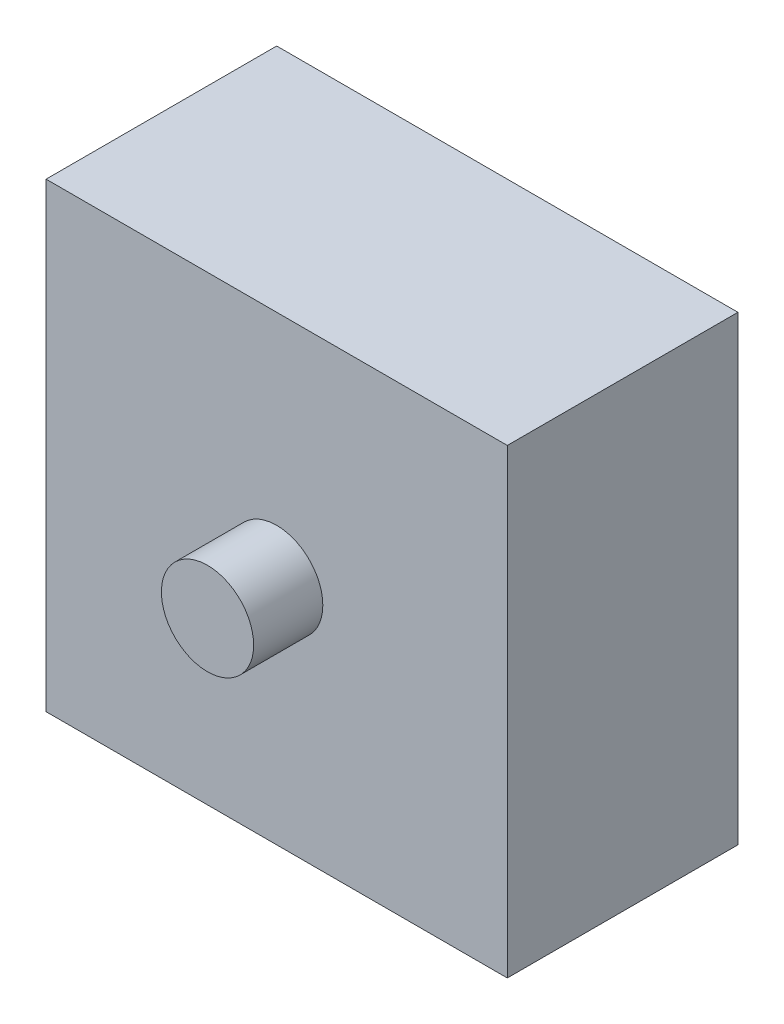
ISO-10303-21;
HEADER;
FILE_DESCRIPTION(('STEP AP214'),'2;1');
FILE_NAME('part.step','',(''),(''),'','','');
FILE_SCHEMA(('AUTOMOTIVE_DESIGN { 1 0 10303 214 1 1 1 1 }'));
ENDSEC;
DATA;
#1=APPLICATION_CONTEXT('core data for automotive mechanical design processes');
#2=APPLICATION_PROTOCOL_DEFINITION('international standard','automotive_design',2000,#1);
#3=PRODUCT_CONTEXT('',#1,'mechanical');
#4=PRODUCT('Part','Part','',(#3));
#5=PRODUCT_RELATED_PRODUCT_CATEGORY('part','',(#4));
#6=PRODUCT_DEFINITION_FORMATION('','',#4);
#7=PRODUCT_DEFINITION_CONTEXT('part definition',#1,'design');
#8=PRODUCT_DEFINITION('design','',#6,#7);
#9=PRODUCT_DEFINITION_SHAPE('','',#8);
#10=(LENGTH_UNIT() NAMED_UNIT(*) SI_UNIT(.MILLI.,.METRE.));
#11=(NAMED_UNIT(*) PLANE_ANGLE_UNIT() SI_UNIT($,.RADIAN.));
#12=(NAMED_UNIT(*) SI_UNIT($,.STERADIAN.) SOLID_ANGLE_UNIT());
#13=UNCERTAINTY_MEASURE_WITH_UNIT(LENGTH_MEASURE(1.E-05),#10,'distance_accuracy_value','');
#14=(GEOMETRIC_REPRESENTATION_CONTEXT(3) GLOBAL_UNCERTAINTY_ASSIGNED_CONTEXT((#13)) GLOBAL_UNIT_ASSIGNED_CONTEXT((#10,
#11,#12)) REPRESENTATION_CONTEXT('',''));
#15=CARTESIAN_POINT('',(0.,0.,0.));
#16=DIRECTION('',(0.,0.,1.));
#17=DIRECTION('',(1.,0.,0.));
#18=AXIS2_PLACEMENT_3D('',#15,#16,#17);
#19=CARTESIAN_POINT('',(100.,-100.,100.));
#20=DIRECTION('',(-1.,0.,0.));
#21=DIRECTION('',(0.,0.,1.));
#22=AXIS2_PLACEMENT_3D('',#19,#20,#21);
#23=PLANE('',#22);
#24=DIRECTION('',(0.,1.,0.));
#25=VECTOR('',#24,1.);
#26=CARTESIAN_POINT('',(100.,-100.,0.));
#27=LINE('',#26,#25);
#28=CARTESIAN_POINT('',(100.,-100.,0.));
#29=VERTEX_POINT('',#28);
#30=CARTESIAN_POINT('',(100.,100.,0.));
#31=VERTEX_POINT('',#30);
#32=EDGE_CURVE('E104',#29,#31,#27,.T.);
#33=ORIENTED_EDGE('',*,*,#32,.T.);
#34=DIRECTION('',(0.,0.,-1.));
#35=VECTOR('',#34,1.);
#36=CARTESIAN_POINT('',(100.,100.,100.));
#37=LINE('',#36,#35);
#38=CARTESIAN_POINT('',(100.,100.,100.));
#39=VERTEX_POINT('',#38);
#40=EDGE_CURVE('E45',#39,#31,#37,.T.);
#41=ORIENTED_EDGE('',*,*,#40,.F.);
#42=DIRECTION('',(0.,1.,0.));
#43=VECTOR('',#42,1.);
#44=CARTESIAN_POINT('',(100.,-100.,100.));
#45=LINE('',#44,#43);
#46=CARTESIAN_POINT('',(100.,-100.,100.));
#47=VERTEX_POINT('',#46);
#48=EDGE_CURVE('E95',#47,#39,#45,.T.);
#49=ORIENTED_EDGE('',*,*,#48,.F.);
#50=DIRECTION('',(0.,0.,-1.));
#51=VECTOR('',#50,1.);
#52=CARTESIAN_POINT('',(100.,-100.,100.));
#53=LINE('',#52,#51);
#54=EDGE_CURVE('E101',#47,#29,#53,.T.);
#55=ORIENTED_EDGE('',*,*,#54,.T.);
#56=EDGE_LOOP('',(#33,#41,#49,#55));
#57=FACE_BOUND('',#56,.T.);
#58=ADVANCED_FACE('F39',(#57),#23,.F.);
#59=CARTESIAN_POINT('',(-100.,100.,100.));
#60=DIRECTION('',(0.,-1.,0.));
#61=DIRECTION('',(0.,0.,-1.));
#62=AXIS2_PLACEMENT_3D('',#59,#60,#61);
#63=PLANE('',#62);
#64=DIRECTION('',(-1.,0.,0.));
#65=VECTOR('',#64,1.);
#66=CARTESIAN_POINT('',(-100.,100.,0.));
#67=LINE('',#66,#65);
#68=CARTESIAN_POINT('',(-100.,100.,0.));
#69=VERTEX_POINT('',#68);
#70=EDGE_CURVE('E100',#31,#69,#67,.T.);
#71=ORIENTED_EDGE('',*,*,#70,.T.);
#72=DIRECTION('',(0.,0.,-1.));
#73=VECTOR('',#72,1.);
#74=CARTESIAN_POINT('',(-100.,100.,100.));
#75=LINE('',#74,#73);
#76=CARTESIAN_POINT('',(-100.,100.,100.));
#77=VERTEX_POINT('',#76);
#78=EDGE_CURVE('E92',#77,#69,#75,.T.);
#79=ORIENTED_EDGE('',*,*,#78,.F.);
#80=DIRECTION('',(-1.,0.,0.));
#81=VECTOR('',#80,1.);
#82=CARTESIAN_POINT('',(-100.,100.,100.));
#83=LINE('',#82,#81);
#84=EDGE_CURVE('E87',#39,#77,#83,.T.);
#85=ORIENTED_EDGE('',*,*,#84,.F.);
#86=ORIENTED_EDGE('',*,*,#40,.T.);
#87=EDGE_LOOP('',(#71,#79,#85,#86));
#88=FACE_BOUND('',#87,.T.);
#89=ADVANCED_FACE('F96',(#88),#63,.F.);
#90=CARTESIAN_POINT('',(-100.,-100.,100.));
#91=DIRECTION('',(1.,0.,0.));
#92=DIRECTION('',(0.,0.,-1.));
#93=AXIS2_PLACEMENT_3D('',#90,#91,#92);
#94=PLANE('',#93);
#95=DIRECTION('',(0.,-1.,0.));
#96=VECTOR('',#95,1.);
#97=CARTESIAN_POINT('',(-100.,-100.,0.));
#98=LINE('',#97,#96);
#99=CARTESIAN_POINT('',(-100.,-100.,0.));
#100=VERTEX_POINT('',#99);
#101=EDGE_CURVE('E71',#69,#100,#98,.T.);
#102=ORIENTED_EDGE('',*,*,#101,.T.);
#103=DIRECTION('',(0.,0.,-1.));
#104=VECTOR('',#103,1.);
#105=CARTESIAN_POINT('',(-100.,-100.,100.));
#106=LINE('',#105,#104);
#107=CARTESIAN_POINT('',(-100.,-100.,100.));
#108=VERTEX_POINT('',#107);
#109=EDGE_CURVE('E98',#108,#100,#106,.T.);
#110=ORIENTED_EDGE('',*,*,#109,.F.);
#111=DIRECTION('',(0.,-1.,0.));
#112=VECTOR('',#111,1.);
#113=CARTESIAN_POINT('',(-100.,-100.,100.));
#114=LINE('',#113,#112);
#115=EDGE_CURVE('E89',#77,#108,#114,.T.);
#116=ORIENTED_EDGE('',*,*,#115,.F.);
#117=ORIENTED_EDGE('',*,*,#78,.T.);
#118=EDGE_LOOP('',(#102,#110,#116,#117));
#119=FACE_BOUND('',#118,.T.);
#120=ADVANCED_FACE('F97',(#119),#94,.F.);
#121=CARTESIAN_POINT('',(-100.,-100.,100.));
#122=DIRECTION('',(0.,1.,0.));
#123=DIRECTION('',(0.,0.,1.));
#124=AXIS2_PLACEMENT_3D('',#121,#122,#123);
#125=PLANE('',#124);
#126=DIRECTION('',(1.,0.,0.));
#127=VECTOR('',#126,1.);
#128=CARTESIAN_POINT('',(-100.,-100.,0.));
#129=LINE('',#128,#127);
#130=EDGE_CURVE('E80',#100,#29,#129,.T.);
#131=ORIENTED_EDGE('',*,*,#130,.T.);
#132=ORIENTED_EDGE('',*,*,#54,.F.);
#133=DIRECTION('',(1.,0.,0.));
#134=VECTOR('',#133,1.);
#135=CARTESIAN_POINT('',(-100.,-100.,100.));
#136=LINE('',#135,#134);
#137=EDGE_CURVE('E57',#108,#47,#136,.T.);
#138=ORIENTED_EDGE('',*,*,#137,.F.);
#139=ORIENTED_EDGE('',*,*,#109,.T.);
#140=EDGE_LOOP('',(#131,#132,#138,#139));
#141=FACE_BOUND('',#140,.T.);
#142=ADVANCED_FACE('F114',(#141),#125,.F.);
#143=CARTESIAN_POINT('',(0.,0.,100.));
#144=DIRECTION('',(0.,0.,-1.));
#145=DIRECTION('',(-1.,0.,0.));
#146=AXIS2_PLACEMENT_3D('',#143,#144,#145);
#147=PLANE('',#146);
#148=CARTESIAN_POINT('',(0.,0.,100.));
#149=DIRECTION('',(0.,0.,1.));
#150=DIRECTION('',(1.,0.,0.));
#151=AXIS2_PLACEMENT_3D('',#148,#149,#150);
#152=CIRCLE('',#151,20.);
#153=CARTESIAN_POINT('',(20.,0.,100.));
#154=VERTEX_POINT('',#153);
#155=EDGE_CURVE('E11',#154,#154,#152,.T.);
#156=ORIENTED_EDGE('',*,*,#155,.F.);
#157=EDGE_LOOP('',(#156));
#158=FACE_BOUND('',#157,.T.);
#159=ORIENTED_EDGE('',*,*,#48,.T.);
#160=ORIENTED_EDGE('',*,*,#84,.T.);
#161=ORIENTED_EDGE('',*,*,#115,.T.);
#162=ORIENTED_EDGE('',*,*,#137,.T.);
#163=EDGE_LOOP('',(#159,#160,#161,#162));
#164=FACE_BOUND('',#163,.T.);
#165=ADVANCED_FACE('F86',(#158,#164),#147,.F.);
#166=CARTESIAN_POINT('',(0.,0.,0.));
#167=DIRECTION('',(0.,0.,-1.));
#168=DIRECTION('',(-1.,0.,0.));
#169=AXIS2_PLACEMENT_3D('',#166,#167,#168);
#170=PLANE('',#169);
#171=ORIENTED_EDGE('',*,*,#32,.F.);
#172=ORIENTED_EDGE('',*,*,#130,.F.);
#173=ORIENTED_EDGE('',*,*,#101,.F.);
#174=ORIENTED_EDGE('',*,*,#70,.F.);
#175=EDGE_LOOP('',(#171,#172,#173,#174));
#176=FACE_BOUND('',#175,.T.);
#177=ADVANCED_FACE('F118',(#176),#170,.T.);
#178=CARTESIAN_POINT('',(0.,0.,130.));
#179=DIRECTION('',(0.,0.,-1.));
#180=DIRECTION('',(-1.,0.,0.));
#181=AXIS2_PLACEMENT_3D('',#178,#179,#180);
#182=CYLINDRICAL_SURFACE('',#181,20.);
#183=CARTESIAN_POINT('',(0.,0.,130.));
#184=DIRECTION('',(0.,0.,1.));
#185=DIRECTION('',(1.,0.,0.));
#186=AXIS2_PLACEMENT_3D('',#183,#184,#185);
#187=CIRCLE('',#186,20.);
#188=CARTESIAN_POINT('',(20.,0.,130.));
#189=VERTEX_POINT('',#188);
#190=EDGE_CURVE('E107',#189,#189,#187,.T.);
#191=ORIENTED_EDGE('',*,*,#190,.F.);
#192=EDGE_LOOP('',(#191));
#193=FACE_BOUND('',#192,.T.);
#194=ORIENTED_EDGE('',*,*,#155,.T.);
#195=EDGE_LOOP('',(#194));
#196=FACE_BOUND('',#195,.T.);
#197=ADVANCED_FACE('F122',(#193,#196),#182,.T.);
#198=CARTESIAN_POINT('',(0.,0.,130.));
#199=DIRECTION('',(0.,0.,1.));
#200=DIRECTION('',(1.,0.,0.));
#201=AXIS2_PLACEMENT_3D('',#198,#199,#200);
#202=PLANE('',#201);
#203=ORIENTED_EDGE('',*,*,#190,.T.);
#204=EDGE_LOOP('',(#203));
#205=FACE_BOUND('',#204,.T.);
#206=ADVANCED_FACE('F125',(#205),#202,.T.);
#207=CLOSED_SHELL('',(#58,#89,#120,#142,#165,#177,#197,#206));
#208=MANIFOLD_SOLID_BREP('B2',#207);
#209=ADVANCED_BREP_SHAPE_REPRESENTATION('',(#18,#208),#14);
#210=SHAPE_DEFINITION_REPRESENTATION(#9,#209);
ENDSEC;
END-ISO-10303-21;
